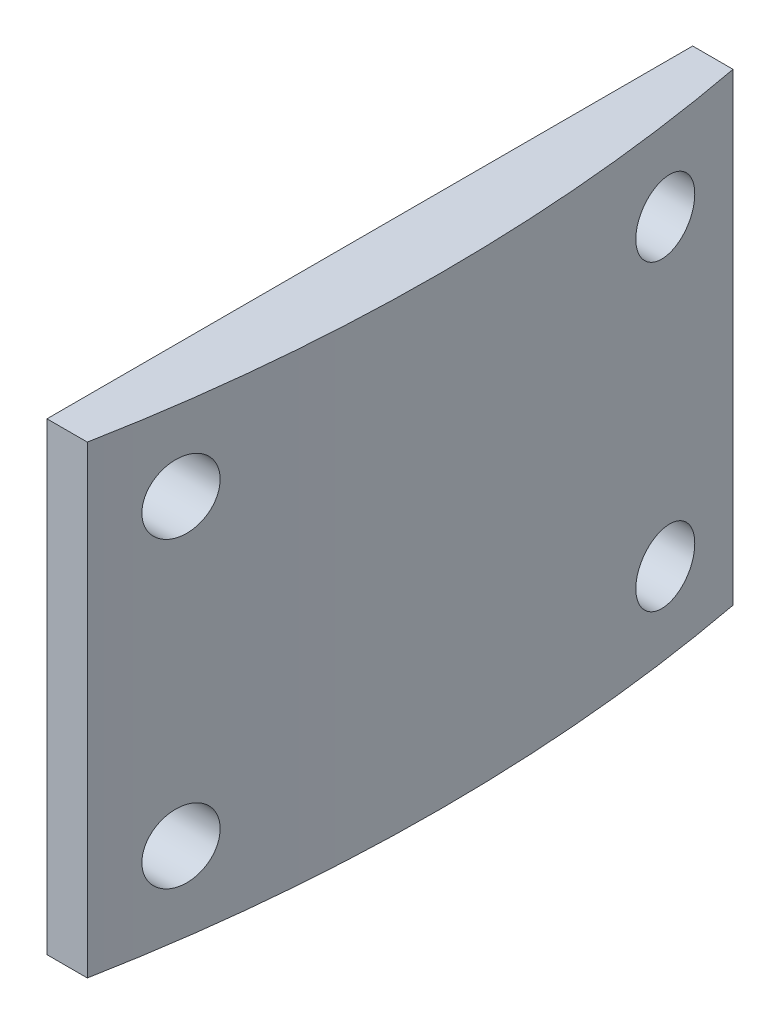
ISO-10303-21;
HEADER;
FILE_DESCRIPTION(('STEP AP214'),'2;1');
FILE_NAME('part.step','',(''),(''),'','','');
FILE_SCHEMA(('AUTOMOTIVE_DESIGN { 1 0 10303 214 1 1 1 1 }'));
ENDSEC;
DATA;
#1=APPLICATION_CONTEXT('core data for automotive mechanical design processes');
#2=APPLICATION_PROTOCOL_DEFINITION('international standard','automotive_design',2000,#1);
#3=PRODUCT_CONTEXT('',#1,'mechanical');
#4=PRODUCT('Part','Part','',(#3));
#5=PRODUCT_RELATED_PRODUCT_CATEGORY('part','',(#4));
#6=PRODUCT_DEFINITION_FORMATION('','',#4);
#7=PRODUCT_DEFINITION_CONTEXT('part definition',#1,'design');
#8=PRODUCT_DEFINITION('design','',#6,#7);
#9=PRODUCT_DEFINITION_SHAPE('','',#8);
#10=(LENGTH_UNIT() NAMED_UNIT(*) SI_UNIT(.MILLI.,.METRE.));
#11=(NAMED_UNIT(*) PLANE_ANGLE_UNIT() SI_UNIT($,.RADIAN.));
#12=(NAMED_UNIT(*) SI_UNIT($,.STERADIAN.) SOLID_ANGLE_UNIT());
#13=UNCERTAINTY_MEASURE_WITH_UNIT(LENGTH_MEASURE(1.E-05),#10,'distance_accuracy_value','');
#14=(GEOMETRIC_REPRESENTATION_CONTEXT(3) GLOBAL_UNCERTAINTY_ASSIGNED_CONTEXT((#13)) GLOBAL_UNIT_ASSIGNED_CONTEXT((#10,
#11,#12)) REPRESENTATION_CONTEXT('',''));
#15=CARTESIAN_POINT('',(0.,0.,0.));
#16=DIRECTION('',(0.,0.,1.));
#17=DIRECTION('',(1.,0.,0.));
#18=AXIS2_PLACEMENT_3D('',#15,#16,#17);
#19=CARTESIAN_POINT('',(-86.,23.,0.));
#20=DIRECTION('',(0.,-1.,0.));
#21=DIRECTION('',(0.,0.,-1.));
#22=AXIS2_PLACEMENT_3D('',#19,#20,#21);
#23=CYLINDRICAL_SURFACE('',#22,86.);
#24=CARTESIAN_POINT('',(-1.09823323393088,4.,13.7));
#25=CARTESIAN_POINT('',(-1.09823238934928,4.09461660650209,13.6999956556959));
#26=CARTESIAN_POINT('',(-1.09695288068832,4.18930217870366,13.6920726748604));
#27=CARTESIAN_POINT('',(-1.09188265318241,4.37604750009561,13.6605948866621));
#28=CARTESIAN_POINT('',(-1.0880889092167,4.46810394657926,13.6370212484123));
#29=CARTESIAN_POINT('',(-1.07814696690637,4.64684041118867,13.5749717606372));
#30=CARTESIAN_POINT('',(-1.07200058310217,4.73352451316733,13.5365073957486));
#31=CARTESIAN_POINT('',(-1.05759822182475,4.89915249166427,13.4458349382769));
#32=CARTESIAN_POINT('',(-1.04934270525876,4.97809805407112,13.3936298483691));
#33=CARTESIAN_POINT('',(-1.03097926415613,5.12658407823612,13.2766348294509));
#34=CARTESIAN_POINT('',(-1.02086028744792,5.1960638779774,13.2117696684666));
#35=CARTESIAN_POINT('',(-0.999174665954189,5.32317683807192,13.0715231762934));
#36=CARTESIAN_POINT('',(-0.987607883529901,5.38080887071348,12.996140845189));
#37=CARTESIAN_POINT('',(-0.963286094296263,5.48329943294548,12.8360395061718));
#38=CARTESIAN_POINT('',(-0.950518728562843,5.52800000605188,12.7512212474413));
#39=CARTESIAN_POINT('',(-0.9243402576721,5.60251859543299,12.5753733725884));
#40=CARTESIAN_POINT('',(-0.910929117833725,5.63233580893086,12.4843434217216));
#41=CARTESIAN_POINT('',(-0.883761715338452,5.67648760433625,12.2977616549108));
#42=CARTESIAN_POINT('',(-0.870003427762707,5.69067963207942,12.202176372701));
#43=CARTESIAN_POINT('',(-0.842672589945407,5.7026963284009,12.0099546972808));
#44=CARTESIAN_POINT('',(-0.829100043359098,5.70052067533788,11.9133182834519));
#45=CARTESIAN_POINT('',(-0.802489592723157,5.67981128127098,11.7215024294293));
#46=CARTESIAN_POINT('',(-0.789453017109356,5.66123919078498,11.6263269374469));
#47=CARTESIAN_POINT('',(-0.764290948523016,5.60816409434666,11.4403980981461));
#48=CARTESIAN_POINT('',(-0.752165441862862,5.57366132778753,11.349644684399));
#49=CARTESIAN_POINT('',(-0.729171197522125,5.48983638125947,11.1755733117123));
#50=CARTESIAN_POINT('',(-0.71829729233167,5.44057840015831,11.0922251299305));
#51=CARTESIAN_POINT('',(-0.697991204847541,5.32854509696136,10.9349710131723));
#52=CARTESIAN_POINT('',(-0.688558964593615,5.26577031853526,10.8610646986175));
#53=CARTESIAN_POINT('',(-0.671400622730218,5.12901077464027,10.7254266342001));
#54=CARTESIAN_POINT('',(-0.663661689765663,5.0551180278206,10.6636037311195));
#55=CARTESIAN_POINT('',(-0.64994411674221,4.89785174698937,10.5532489391876));
#56=CARTESIAN_POINT('',(-0.643965400311687,4.81447862452651,10.504716473702));
#57=CARTESIAN_POINT('',(-0.633914089558432,4.6413200194176,10.4227193102826));
#58=CARTESIAN_POINT('',(-0.629826991262918,4.55158962545475,10.3891400367499));
#59=CARTESIAN_POINT('',(-0.62355824563811,4.36770631962592,10.3374985463865));
#60=CARTESIAN_POINT('',(-0.621376535978219,4.27355355253433,10.3194358219663));
#61=CARTESIAN_POINT('',(-0.618959597037669,4.08402316572226,10.2994195298237));
#62=CARTESIAN_POINT('',(-0.618714307510821,3.98865445830996,10.297382703248));
#63=CARTESIAN_POINT('',(-0.620147505127369,3.79893105971888,10.3092590651682));
#64=CARTESIAN_POINT('',(-0.621825964247447,3.7045763537893,10.323172021323));
#65=CARTESIAN_POINT('',(-0.627076488057534,3.51969562769991,10.3665038164833));
#66=CARTESIAN_POINT('',(-0.630645859332186,3.42916435897929,10.3959005999832));
#67=CARTESIAN_POINT('',(-0.639618723750359,3.25434022291627,10.4693203305905));
#68=CARTESIAN_POINT('',(-0.645022227720241,3.17004739240117,10.5133433640325));
#69=CARTESIAN_POINT('',(-0.65758760378121,3.00984662032979,10.6148602895866));
#70=CARTESIAN_POINT('',(-0.664753989454039,2.93396093893322,10.672388742663));
#71=CARTESIAN_POINT('',(-0.680707042037325,2.79292598587565,10.7991815178668));
#72=CARTESIAN_POINT('',(-0.689493752327297,2.7277770017472,10.8684461541926));
#73=CARTESIAN_POINT('',(-0.708573260745442,2.60962895245031,11.0171760941626));
#74=CARTESIAN_POINT('',(-0.718874903216449,2.55670627942808,11.0967009386061));
#75=CARTESIAN_POINT('',(-0.740723862361149,2.46494807458946,11.2633425945478));
#76=CARTESIAN_POINT('',(-0.752271229800875,2.42611311716004,11.3504597154202));
#77=CARTESIAN_POINT('',(-0.776443568951132,2.36329864835854,11.530556919443));
#78=CARTESIAN_POINT('',(-0.789076496920188,2.33944175829313,11.6235787032759));
#79=CARTESIAN_POINT('',(-0.815021277608676,2.30769780037563,11.8122166697818));
#80=CARTESIAN_POINT('',(-0.828333162245903,2.29981148401189,11.9078329743244));
#81=CARTESIAN_POINT('',(-0.855375472149323,2.30019675673125,12.0996845137304));
#82=CARTESIAN_POINT('',(-0.869108236368095,2.30858621135776,12.1959191955302));
#83=CARTESIAN_POINT('',(-0.896497528607763,2.34151274547187,12.3855986468433));
#84=CARTESIAN_POINT('',(-0.910154054399002,2.36605029475499,12.4790433351047));
#85=CARTESIAN_POINT('',(-0.937002460070097,2.43069480047814,12.6607628274636));
#86=CARTESIAN_POINT('',(-0.95019290692713,2.47084586945991,12.749022160916));
#87=CARTESIAN_POINT('',(-0.975625422728232,2.56561738449194,12.9175461559871));
#88=CARTESIAN_POINT('',(-0.987867539036589,2.62023710730356,12.9978112169363));
#89=CARTESIAN_POINT('',(-1.01091739585572,2.74217800589422,13.1476831635157));
#90=CARTESIAN_POINT('',(-1.02173111639353,2.8094431731552,13.2173346844583));
#91=CARTESIAN_POINT('',(-1.04158316707755,2.95498189811627,13.3443453770041));
#92=CARTESIAN_POINT('',(-1.05062114780131,3.03325761723596,13.4017021294973));
#93=CARTESIAN_POINT('',(-1.06648240035618,3.19774682782218,13.5018569883923));
#94=CARTESIAN_POINT('',(-1.07332673524422,3.28387395516054,13.5447937571661));
#95=CARTESIAN_POINT('',(-1.08463870560966,3.46219583752384,13.615532030002));
#96=CARTESIAN_POINT('',(-1.08910941993909,3.554382557185,13.6433531418652));
#97=CARTESIAN_POINT('',(-1.09427106967746,3.70599765913323,13.6754281807255));
#98=CARTESIAN_POINT('',(-1.09575432460879,3.76439871860997,13.6846302672464));
#99=CARTESIAN_POINT('',(-1.09773566687477,3.88185755738207,13.6969175111722));
#100=CARTESIAN_POINT('',(-1.09823376134172,3.94091533191986,13.7000027128617));
#101=CARTESIAN_POINT('',(-1.09823323393088,4.,13.7));
#102=B_SPLINE_CURVE_WITH_KNOTS('',3,(#24,#25,#26,#27,#28,#29,#30,#31,#32,#33,#34,#35,#36,#37,
#38,#39,#40,#41,#42,#43,#44,#45,#46,#47,#48,#49,#50,#51,#52,#53,#54,#55,#56,#57,#58,#59,#60,#61,
#62,#63,#64,#65,#66,#67,#68,#69,#70,#71,#72,#73,#74,#75,#76,#77,#78,#79,#80,#81,#82,#83,#84,#85,
#86,#87,#88,#89,#90,#91,#92,#93,#94,#95,#96,#97,#98,#99,#100,#101),.UNSPECIFIED.,.T.,.F.,(4,2,2,
2,2,2,2,2,2,2,2,2,2,2,2,2,2,2,2,2,2,2,2,2,2,2,2,2,2,2,2,2,2,2,2,2,2,2,4),(0.,0.283632613605656,
0.567607114244634,0.851363031370888,1.13505699248658,1.4204911522477,1.70595246805858,
1.99476615600279,2.28359542026162,2.5750384856026,2.86648727810669,3.15861954886899,
3.45074742984905,3.74162230269857,4.03248547822695,4.32106175496406,4.60962550921435,
4.89593847168151,5.18224206769953,5.46705725087639,5.75186828519239,6.03627472115702,
6.32068283592084,6.60582685364614,6.89097850638832,7.1778663556988,7.46476590073994,
7.75398459300819,8.04321689401915,8.33455157181348,8.62589472576423,8.91806705660865,
9.21022478551032,9.5011177560327,9.79206791001927,10.0801343342251,10.3678261854089,
10.5449458346816,10.7220642016485),.UNSPECIFIED.);
#103=CARTESIAN_POINT('',(-1.09823323393088,4.,13.7));
#104=VERTEX_POINT('',#103);
#105=EDGE_CURVE('E112',#104,#104,#102,.T.);
#106=ORIENTED_EDGE('',*,*,#105,.T.);
#107=EDGE_LOOP('',(#106));
#108=FACE_BOUND('',#107,.T.);
#109=CARTESIAN_POINT('',(-1.09823323393088,19.,13.7));
#110=CARTESIAN_POINT('',(-1.09823238934928,19.0946166065021,13.6999956556959));
#111=CARTESIAN_POINT('',(-1.09695288068832,19.1893021787037,13.6920726748604));
#112=CARTESIAN_POINT('',(-1.09188265318241,19.3760475000956,13.6605948866621));
#113=CARTESIAN_POINT('',(-1.0880889092167,19.4681039465793,13.6370212484123));
#114=CARTESIAN_POINT('',(-1.07814696690637,19.6468404111887,13.5749717606372));
#115=CARTESIAN_POINT('',(-1.07200058310217,19.7335245131673,13.5365073957486));
#116=CARTESIAN_POINT('',(-1.05759822182475,19.8991524916643,13.4458349382769));
#117=CARTESIAN_POINT('',(-1.04934270525876,19.9780980540711,13.3936298483691));
#118=CARTESIAN_POINT('',(-1.03097926415613,20.1265840782361,13.2766348294509));
#119=CARTESIAN_POINT('',(-1.02086028744792,20.1960638779774,13.2117696684666));
#120=CARTESIAN_POINT('',(-0.999174665954189,20.3231768380719,13.0715231762934));
#121=CARTESIAN_POINT('',(-0.987607883529902,20.3808088707135,12.996140845189));
#122=CARTESIAN_POINT('',(-0.963286094296263,20.4832994329455,12.8360395061718));
#123=CARTESIAN_POINT('',(-0.950518728562843,20.5280000060519,12.7512212474413));
#124=CARTESIAN_POINT('',(-0.9243402576721,20.602518595433,12.5753733725884));
#125=CARTESIAN_POINT('',(-0.910929117833725,20.6323358089309,12.4843434217216));
#126=CARTESIAN_POINT('',(-0.883761715338453,20.6764876043363,12.2977616549108));
#127=CARTESIAN_POINT('',(-0.870003427762709,20.6906796320794,12.202176372701));
#128=CARTESIAN_POINT('',(-0.842672589945409,20.7026963284009,12.0099546972808));
#129=CARTESIAN_POINT('',(-0.8291000433591,20.7005206753379,11.9133182834519));
#130=CARTESIAN_POINT('',(-0.802489592723156,20.679811281271,11.7215024294293));
#131=CARTESIAN_POINT('',(-0.789453017109352,20.661239190785,11.6263269374469));
#132=CARTESIAN_POINT('',(-0.764290948523004,20.6081640943467,11.4403980981461));
#133=CARTESIAN_POINT('',(-0.752165441862844,20.5736613277875,11.349644684399));
#134=CARTESIAN_POINT('',(-0.729171197522115,20.4898363812595,11.1755733117123));
#135=CARTESIAN_POINT('',(-0.718297292331673,20.4405784001583,11.0922251299305));
#136=CARTESIAN_POINT('',(-0.697991204847549,20.3285450969614,10.9349710131723));
#137=CARTESIAN_POINT('',(-0.688558964593617,20.2657703185353,10.8610646986175));
#138=CARTESIAN_POINT('',(-0.671400622730217,20.1290107746403,10.7254266342001));
#139=CARTESIAN_POINT('',(-0.663661689765664,20.0551180278206,10.6636037311195));
#140=CARTESIAN_POINT('',(-0.649944116742213,19.8978517469894,10.5532489391876));
#141=CARTESIAN_POINT('',(-0.643965400311688,19.8144786245265,10.504716473702));
#142=CARTESIAN_POINT('',(-0.633914089558431,19.6413200194176,10.4227193102826));
#143=CARTESIAN_POINT('',(-0.629826991262918,19.5515896254548,10.3891400367499));
#144=CARTESIAN_POINT('',(-0.62355824563811,19.3677063196259,10.3374985463865));
#145=CARTESIAN_POINT('',(-0.62137653597822,19.2735535525343,10.3194358219663));
#146=CARTESIAN_POINT('',(-0.61895959703767,19.0840231657223,10.2994195298237));
#147=CARTESIAN_POINT('',(-0.618714307510822,18.98865445831,10.297382703248));
#148=CARTESIAN_POINT('',(-0.62014750512737,18.7989310597189,10.3092590651682));
#149=CARTESIAN_POINT('',(-0.621825964247448,18.7045763537893,10.323172021323));
#150=CARTESIAN_POINT('',(-0.627076488057535,18.5196956276999,10.3665038164833));
#151=CARTESIAN_POINT('',(-0.630645859332187,18.4291643589793,10.3959005999832));
#152=CARTESIAN_POINT('',(-0.639618723750359,18.2543402229163,10.4693203305905));
#153=CARTESIAN_POINT('',(-0.645022227720241,18.1700473924012,10.5133433640325));
#154=CARTESIAN_POINT('',(-0.65758760378121,18.0098466203298,10.6148602895866));
#155=CARTESIAN_POINT('',(-0.66475398945404,17.9339609389332,10.672388742663));
#156=CARTESIAN_POINT('',(-0.680707042037325,17.7929259858757,10.7991815178668));
#157=CARTESIAN_POINT('',(-0.689493752327298,17.7277770017472,10.8684461541926));
#158=CARTESIAN_POINT('',(-0.708573260745442,17.6096289524503,11.0171760941626));
#159=CARTESIAN_POINT('',(-0.718874903216449,17.5567062794281,11.0967009386061));
#160=CARTESIAN_POINT('',(-0.740723862361149,17.4649480745895,11.2633425945478));
#161=CARTESIAN_POINT('',(-0.752271229800875,17.42611311716,11.3504597154202));
#162=CARTESIAN_POINT('',(-0.776443568951133,17.3632986483585,11.530556919443));
#163=CARTESIAN_POINT('',(-0.789076496920188,17.3394417582931,11.6235787032759));
#164=CARTESIAN_POINT('',(-0.815021277608676,17.3076978003756,11.8122166697818));
#165=CARTESIAN_POINT('',(-0.828333162245903,17.2998114840119,11.9078329743244));
#166=CARTESIAN_POINT('',(-0.855375472149323,17.3001967567313,12.0996845137304));
#167=CARTESIAN_POINT('',(-0.869108236368095,17.3085862113578,12.1959191955302));
#168=CARTESIAN_POINT('',(-0.896497528607763,17.3415127454719,12.3855986468433));
#169=CARTESIAN_POINT('',(-0.910154054399002,17.366050294755,12.4790433351047));
#170=CARTESIAN_POINT('',(-0.937002460070097,17.4306948004781,12.6607628274636));
#171=CARTESIAN_POINT('',(-0.95019290692713,17.4708458694599,12.749022160916));
#172=CARTESIAN_POINT('',(-0.975625422728232,17.5656173844919,12.9175461559871));
#173=CARTESIAN_POINT('',(-0.987867539036589,17.6202371073036,12.9978112169363));
#174=CARTESIAN_POINT('',(-1.01091739585572,17.7421780058942,13.1476831635157));
#175=CARTESIAN_POINT('',(-1.02173111639353,17.8094431731552,13.2173346844583));
#176=CARTESIAN_POINT('',(-1.04158316707755,17.9549818981163,13.3443453770041));
#177=CARTESIAN_POINT('',(-1.05062114780131,18.033257617236,13.4017021294973));
#178=CARTESIAN_POINT('',(-1.06648240035618,18.1977468278222,13.5018569883923));
#179=CARTESIAN_POINT('',(-1.07332673524422,18.2838739551605,13.5447937571661));
#180=CARTESIAN_POINT('',(-1.08463870560966,18.4621958375239,13.615532030002));
#181=CARTESIAN_POINT('',(-1.08910941993909,18.554382557185,13.6433531418652));
#182=CARTESIAN_POINT('',(-1.09427106967746,18.7059976591332,13.6754281807255));
#183=CARTESIAN_POINT('',(-1.09575432460879,18.76439871861,13.6846302672464));
#184=CARTESIAN_POINT('',(-1.09773566687477,18.8818575573821,13.6969175111722));
#185=CARTESIAN_POINT('',(-1.09823376134172,18.9409153319199,13.7000027128617));
#186=CARTESIAN_POINT('',(-1.09823323393088,19.,13.7));
#187=B_SPLINE_CURVE_WITH_KNOTS('',3,(#109,#110,#111,#112,#113,#114,#115,#116,#117,#118,#119,
#120,#121,#122,#123,#124,#125,#126,#127,#128,#129,#130,#131,#132,#133,#134,#135,#136,#137,#138,
#139,#140,#141,#142,#143,#144,#145,#146,#147,#148,#149,#150,#151,#152,#153,#154,#155,#156,#157,
#158,#159,#160,#161,#162,#163,#164,#165,#166,#167,#168,#169,#170,#171,#172,#173,#174,#175,#176,
#177,#178,#179,#180,#181,#182,#183,#184,#185,#186),.UNSPECIFIED.,.T.,.F.,(4,2,2,2,2,2,2,2,2,2,2,
2,2,2,2,2,2,2,2,2,2,2,2,2,2,2,2,2,2,2,2,2,2,2,2,2,2,2,4),(0.,0.283632613605657,
0.567607114244634,0.851363031370889,1.13505699248658,1.4204911522477,1.70595246805858,
1.99476615600279,2.28359542026162,2.5750384856026,2.86648727810669,3.158619548869,
3.45074742984905,3.74162230269857,4.03248547822695,4.32106175496406,4.60962550921435,
4.89593847168151,5.18224206769953,5.46705725087639,5.75186828519239,6.03627472115702,
6.32068283592084,6.60582685364614,6.89097850638832,7.17786635569879,7.46476590073993,
7.75398459300819,8.04321689401915,8.33455157181348,8.62589472576423,8.91806705660865,
9.21022478551032,9.5011177560327,9.79206791001927,10.0801343342251,10.3678261854089,
10.5449458346816,10.7220642016485),.UNSPECIFIED.);
#188=CARTESIAN_POINT('',(-1.09823323393088,19.,13.7));
#189=VERTEX_POINT('',#188);
#190=EDGE_CURVE('E136',#189,#189,#187,.T.);
#191=ORIENTED_EDGE('',*,*,#190,.T.);
#192=EDGE_LOOP('',(#191));
#193=FACE_BOUND('',#192,.T.);
#194=CARTESIAN_POINT('',(-0.619030223357145,19.,-10.3));
#195=CARTESIAN_POINT('',(-0.619030596904295,19.0949561140651,-10.300004283749));
#196=CARTESIAN_POINT('',(-0.619992147030582,19.1899811422341,-10.3079835108829));
#197=CARTESIAN_POINT('',(-0.623826558895004,19.3774058628432,-10.3396931122186));
#198=CARTESIAN_POINT('',(-0.626701716453331,19.4698022626167,-10.3634424062288));
#199=CARTESIAN_POINT('',(-0.634316776572341,19.649218964929,-10.4259826451769));
#200=CARTESIAN_POINT('',(-0.639055542736889,19.7362425063978,-10.4647644233605));
#201=CARTESIAN_POINT('',(-0.650317239477932,19.9024953526684,-10.5562192576347));
#202=CARTESIAN_POINT('',(-0.656839744367727,19.9817265109852,-10.6088889992753));
#203=CARTESIAN_POINT('',(-0.671575341554959,20.1304422513217,-10.7267643275984));
#204=CARTESIAN_POINT('',(-0.679793365926328,20.1998973815206,-10.7920064485283));
#205=CARTESIAN_POINT('',(-0.697751130722403,20.3268772394952,-10.9330408014666));
#206=CARTESIAN_POINT('',(-0.707490975684748,20.3844011470533,-11.0088337581991));
#207=CARTESIAN_POINT('',(-0.728363663323788,20.4863175176866,-11.1693608807518));
#208=CARTESIAN_POINT('',(-0.739505683549196,20.5306163077276,-11.2541533179533));
#209=CARTESIAN_POINT('',(-0.762878357947854,20.6043624133738,-11.4298267664131));
#210=CARTESIAN_POINT('',(-0.775109059108582,20.6338090875955,-11.5207080404238));
#211=CARTESIAN_POINT('',(-0.80046691776403,20.6772646229908,-11.7067691552202));
#212=CARTESIAN_POINT('',(-0.813600598692123,20.6911450311392,-11.8019781127485));
#213=CARTESIAN_POINT('',(-0.840327457755062,20.7026866326145,-11.9933107781639));
#214=CARTESIAN_POINT('',(-0.853920654326494,20.7003471744011,-12.0894345226426));
#215=CARTESIAN_POINT('',(-0.881268060965328,20.6794669913172,-12.2805067690149));
#216=CARTESIAN_POINT('',(-0.895022746261263,20.6608248834659,-12.3754441389799));
#217=CARTESIAN_POINT('',(-0.922188005266204,20.6077180451985,-12.5608395378447));
#218=CARTESIAN_POINT('',(-0.93559857264474,20.5732530239206,-12.6512974843684));
#219=CARTESIAN_POINT('',(-0.961647837045131,20.4894059545648,-12.8252254536499));
#220=CARTESIAN_POINT('',(-0.97428593414777,20.4400124853023,-12.9086900634066));
#221=CARTESIAN_POINT('',(-0.998338678090074,20.3276688112192,-13.066136572258));
#222=CARTESIAN_POINT('',(-1.00975335736386,20.2647189659258,-13.1401187227531));
#223=CARTESIAN_POINT('',(-1.03086860257328,20.1274576603512,-13.2759713793396));
#224=CARTESIAN_POINT('',(-1.04057979331962,20.0532224406805,-13.3379172385852));
#225=CARTESIAN_POINT('',(-1.05800327024544,19.8951759024878,-13.4484323260884));
#226=CARTESIAN_POINT('',(-1.06571568492839,19.8113652000832,-13.4970024143013));
#227=CARTESIAN_POINT('',(-1.07875533125692,19.6375717567362,-13.5788036429984));
#228=CARTESIAN_POINT('',(-1.08410883548524,19.5476705758229,-13.6122038751305));
#229=CARTESIAN_POINT('',(-1.0923391174779,19.3634312862054,-13.6634477237458));
#230=CARTESIAN_POINT('',(-1.09521606083056,19.2690934745889,-13.6812923803103));
#231=CARTESIAN_POINT('',(-1.09835674670161,19.0797072537474,-13.7007689758297));
#232=CARTESIAN_POINT('',(-1.09864725532997,18.984676333777,-13.7025669764973));
#233=CARTESIAN_POINT('',(-1.09667324043365,18.7956684636087,-13.6903302503573));
#234=CARTESIAN_POINT('',(-1.09440879123574,18.7016914828307,-13.6762959841291));
#235=CARTESIAN_POINT('',(-1.08742947906113,18.5177632413883,-13.6328956330885));
#236=CARTESIAN_POINT('',(-1.08272245391595,18.42780009782,-13.6035785868803));
#237=CARTESIAN_POINT('',(-1.07105147525813,18.2540933565077,-13.5305233792796));
#238=CARTESIAN_POINT('',(-1.06408747213607,18.1703498955249,-13.486784900897));
#239=CARTESIAN_POINT('',(-1.04812632302061,18.0109145935616,-13.3858796188379));
#240=CARTESIAN_POINT('',(-1.03911755345498,17.935272572474,-13.328635968002));
#241=CARTESIAN_POINT('',(-1.01942878339415,17.7946523422757,-13.202521693522));
#242=CARTESIAN_POINT('',(-1.00874868673169,17.7296747472315,-13.1336504008118));
#243=CARTESIAN_POINT('',(-0.985970281647108,17.6114426479879,-12.9853928784393));
#244=CARTESIAN_POINT('',(-0.973857294608397,17.558329097426,-12.905896498063));
#245=CARTESIAN_POINT('',(-0.948729689490145,17.4661893873918,-12.7392508366686));
#246=CARTESIAN_POINT('',(-0.935715018110939,17.42716406154,-12.6521011031697));
#247=CARTESIAN_POINT('',(-0.909066964968079,17.3639057333595,-12.4716283641437));
#248=CARTESIAN_POINT('',(-0.895428527676105,17.3398320791122,-12.3782502237341));
#249=CARTESIAN_POINT('',(-0.868085700546979,17.3077839698744,-12.1887787394055));
#250=CARTESIAN_POINT('',(-0.854381308387709,17.2998100859381,-12.0926852992982));
#251=CARTESIAN_POINT('',(-0.827242690298348,17.3001976718544,-11.9000385240503));
#252=CARTESIAN_POINT('',(-0.813809998808444,17.3086345230597,-11.8034851085409));
#253=CARTESIAN_POINT('',(-0.787648868095052,17.3417916172166,-11.6131154071772));
#254=CARTESIAN_POINT('',(-0.774920426376095,17.3665118024651,-11.5192991116246));
#255=CARTESIAN_POINT('',(-0.75052300383937,17.4315034271054,-11.3373314876308));
#256=CARTESIAN_POINT('',(-0.738851505848996,17.4717366506136,-11.2491668541372));
#257=CARTESIAN_POINT('',(-0.716809662628972,17.566664199264,-11.0808240218792));
#258=CARTESIAN_POINT('',(-0.706439221722397,17.621357460126,-11.0006452359424));
#259=CARTESIAN_POINT('',(-0.687296280242016,17.743235541562,-10.8511856749214));
#260=CARTESIAN_POINT('',(-0.678512713016232,17.8103266786072,-10.7818299242212));
#261=CARTESIAN_POINT('',(-0.662625650959076,17.9553983650469,-10.6553561108548));
#262=CARTESIAN_POINT('',(-0.655522502647066,18.0333811551468,-10.5982405724722));
#263=CARTESIAN_POINT('',(-0.643179437986841,18.1973502161364,-10.4983667581533));
#264=CARTESIAN_POINT('',(-0.637925630920834,18.2832704203824,-10.4555015868146));
#265=CARTESIAN_POINT('',(-0.629300887905376,18.4611052669618,-10.384845326716));
#266=CARTESIAN_POINT('',(-0.625927602653327,18.5530122689695,-10.3570354309286));
#267=CARTESIAN_POINT('',(-0.622025622659843,18.7046039079661,-10.3248067185063));
#268=CARTESIAN_POINT('',(-0.620903242409819,18.7632824692124,-10.3155162976115));
#269=CARTESIAN_POINT('',(-0.619405427322351,18.8812983769603,-10.303111610309));
#270=CARTESIAN_POINT('',(-0.61902998982445,18.9406357211147,-10.2999973219032));
#271=CARTESIAN_POINT('',(-0.619030223357145,19.,-10.3));
#272=B_SPLINE_CURVE_WITH_KNOTS('',3,(#194,#195,#196,#197,#198,#199,#200,#201,#202,#203,#204,
#205,#206,#207,#208,#209,#210,#211,#212,#213,#214,#215,#216,#217,#218,#219,#220,#221,#222,#223,
#224,#225,#226,#227,#228,#229,#230,#231,#232,#233,#234,#235,#236,#237,#238,#239,#240,#241,#242,
#243,#244,#245,#246,#247,#248,#249,#250,#251,#252,#253,#254,#255,#256,#257,#258,#259,#260,#261,
#262,#263,#264,#265,#266,#267,#268,#269,#270,#271),.UNSPECIFIED.,.T.,.F.,(4,2,2,2,2,2,2,2,2,2,2,
2,2,2,2,2,2,2,2,2,2,2,2,2,2,2,2,2,2,2,2,2,2,2,2,2,2,2,4),(0.,0.284650955433206,
0.569644033414384,0.854463596361694,1.13921524675365,1.42480719083395,1.7104187615666,
1.99800776561326,2.28560918802769,2.57556682786618,2.86553611516161,3.15732159151295,
3.44911243177167,3.74112707757933,4.03313397985019,4.32324929951189,4.61334596271537,
4.90012451896841,5.18688389908462,5.47067221277384,5.75445227093623,6.03732730462307,
6.32020855645596,6.60474002743149,6.88928787621874,7.1770551215138,7.46483939161977,
7.7556403481283,8.04645161908071,8.3386018624485,8.63075107053226,8.92218512955258,
9.21359774456425,9.50289224623616,9.79224635146014,10.079378207746,10.3661505467949,
10.5441081123246,10.7220650440048),.UNSPECIFIED.);
#273=CARTESIAN_POINT('',(-0.619030223357145,19.,-10.3));
#274=VERTEX_POINT('',#273);
#275=EDGE_CURVE('E165',#274,#274,#272,.T.);
#276=ORIENTED_EDGE('',*,*,#275,.T.);
#277=EDGE_LOOP('',(#276));
#278=FACE_BOUND('',#277,.T.);
#279=CARTESIAN_POINT('',(-0.619030223357145,4.,-10.3));
#280=CARTESIAN_POINT('',(-0.619030596904295,4.09495611406507,-10.300004283749));
#281=CARTESIAN_POINT('',(-0.619992147030582,4.18998114223414,-10.3079835108829));
#282=CARTESIAN_POINT('',(-0.623826558895003,4.37740586284316,-10.3396931122186));
#283=CARTESIAN_POINT('',(-0.626701716453331,4.46980226261675,-10.3634424062288));
#284=CARTESIAN_POINT('',(-0.634316776572341,4.64921896492897,-10.4259826451769));
#285=CARTESIAN_POINT('',(-0.639055542736889,4.73624250639779,-10.4647644233605));
#286=CARTESIAN_POINT('',(-0.650317239477932,4.90249535266836,-10.5562192576347));
#287=CARTESIAN_POINT('',(-0.656839744367726,4.98172651098518,-10.6088889992753));
#288=CARTESIAN_POINT('',(-0.671575341554959,5.13044225132173,-10.7267643275984));
#289=CARTESIAN_POINT('',(-0.679793365926328,5.19989738152058,-10.7920064485283));
#290=CARTESIAN_POINT('',(-0.697751130722403,5.32687723949519,-10.9330408014666));
#291=CARTESIAN_POINT('',(-0.707490975684747,5.38440114705335,-11.0088337581991));
#292=CARTESIAN_POINT('',(-0.728363663323788,5.48631751768661,-11.1693608807518));
#293=CARTESIAN_POINT('',(-0.739505683549196,5.5306163077276,-11.2541533179533));
#294=CARTESIAN_POINT('',(-0.762878357947854,5.60436241337379,-11.4298267664131));
#295=CARTESIAN_POINT('',(-0.775109059108582,5.63380908759554,-11.5207080404238));
#296=CARTESIAN_POINT('',(-0.80046691776403,5.67726462299078,-11.7067691552202));
#297=CARTESIAN_POINT('',(-0.813600598692123,5.69114503113918,-11.8019781127485));
#298=CARTESIAN_POINT('',(-0.840327457755062,5.70268663261451,-11.9933107781639));
#299=CARTESIAN_POINT('',(-0.853920654326495,5.70034717440109,-12.0894345226426));
#300=CARTESIAN_POINT('',(-0.881268060965328,5.67946699131723,-12.2805067690149));
#301=CARTESIAN_POINT('',(-0.895022746261263,5.66082488346591,-12.3754441389799));
#302=CARTESIAN_POINT('',(-0.922188005266204,5.60771804519847,-12.5608395378447));
#303=CARTESIAN_POINT('',(-0.93559857264474,5.57325302392056,-12.6512974843684));
#304=CARTESIAN_POINT('',(-0.961647837045131,5.48940595456484,-12.8252254536499));
#305=CARTESIAN_POINT('',(-0.97428593414777,5.44001248530229,-12.9086900634066));
#306=CARTESIAN_POINT('',(-0.998338678090074,5.32766881121915,-13.066136572258));
#307=CARTESIAN_POINT('',(-1.00975335736386,5.26471896592582,-13.1401187227531));
#308=CARTESIAN_POINT('',(-1.03086860257328,5.12745766035116,-13.2759713793396));
#309=CARTESIAN_POINT('',(-1.04057979331962,5.05322244068052,-13.3379172385852));
#310=CARTESIAN_POINT('',(-1.05800327024544,4.89517590248776,-13.4484323260884));
#311=CARTESIAN_POINT('',(-1.06571568492839,4.81136520008324,-13.4970024143013));
#312=CARTESIAN_POINT('',(-1.07875533125692,4.63757175673617,-13.5788036429984));
#313=CARTESIAN_POINT('',(-1.08410883548524,4.54767057582294,-13.6122038751305));
#314=CARTESIAN_POINT('',(-1.0923391174779,4.36343128620539,-13.6634477237458));
#315=CARTESIAN_POINT('',(-1.09521606083056,4.26909347458886,-13.6812923803103));
#316=CARTESIAN_POINT('',(-1.09835674670161,4.07970725374738,-13.7007689758297));
#317=CARTESIAN_POINT('',(-1.09864725532997,3.98467633377699,-13.7025669764973));
#318=CARTESIAN_POINT('',(-1.09667324043365,3.79566846360867,-13.6903302503573));
#319=CARTESIAN_POINT('',(-1.09440879123574,3.70169148283071,-13.6762959841291));
#320=CARTESIAN_POINT('',(-1.08742947906113,3.51776324138832,-13.6328956330885));
#321=CARTESIAN_POINT('',(-1.08272245391595,3.42780009782,-13.6035785868803));
#322=CARTESIAN_POINT('',(-1.07105147525813,3.25409335650767,-13.5305233792796));
#323=CARTESIAN_POINT('',(-1.06408747213606,3.1703498955249,-13.486784900897));
#324=CARTESIAN_POINT('',(-1.04812632302061,3.0109145935616,-13.3858796188379));
#325=CARTESIAN_POINT('',(-1.03911755345498,2.93527257247397,-13.328635968002));
#326=CARTESIAN_POINT('',(-1.01942878339415,2.79465234227573,-13.202521693522));
#327=CARTESIAN_POINT('',(-1.00874868673169,2.72967474723151,-13.1336504008118));
#328=CARTESIAN_POINT('',(-0.985970281647108,2.61144264798791,-12.9853928784393));
#329=CARTESIAN_POINT('',(-0.973857294608396,2.55832909742597,-12.905896498063));
#330=CARTESIAN_POINT('',(-0.948729689490146,2.46618938739177,-12.7392508366686));
#331=CARTESIAN_POINT('',(-0.935715018110943,2.42716406153999,-12.6521011031697));
#332=CARTESIAN_POINT('',(-0.909066964968075,2.3639057333595,-12.4716283641437));
#333=CARTESIAN_POINT('',(-0.895428527676091,2.33983207911219,-12.3782502237341));
#334=CARTESIAN_POINT('',(-0.868085700546965,2.3077839698744,-12.1887787394055));
#335=CARTESIAN_POINT('',(-0.854381308387705,2.29981008593807,-12.0926852992982));
#336=CARTESIAN_POINT('',(-0.827242690298352,2.30019767185436,-11.9000385240503));
#337=CARTESIAN_POINT('',(-0.813809998808445,2.3086345230597,-11.8034851085409));
#338=CARTESIAN_POINT('',(-0.787648868095051,2.3417916172166,-11.6131154071772));
#339=CARTESIAN_POINT('',(-0.774920426376095,2.36651180246508,-11.5192991116246));
#340=CARTESIAN_POINT('',(-0.75052300383937,2.43150342710542,-11.3373314876308));
#341=CARTESIAN_POINT('',(-0.738851505848995,2.47173665061362,-11.2491668541372));
#342=CARTESIAN_POINT('',(-0.716809662628972,2.56666419926397,-11.0808240218792));
#343=CARTESIAN_POINT('',(-0.706439221722397,2.621357460126,-11.0006452359424));
#344=CARTESIAN_POINT('',(-0.687296280242016,2.74323554156197,-10.8511856749214));
#345=CARTESIAN_POINT('',(-0.678512713016232,2.81032667860722,-10.7818299242212));
#346=CARTESIAN_POINT('',(-0.662625650959076,2.95539836504689,-10.6553561108548));
#347=CARTESIAN_POINT('',(-0.655522502647066,3.03338115514675,-10.5982405724722));
#348=CARTESIAN_POINT('',(-0.643179437986841,3.19735021613643,-10.4983667581533));
#349=CARTESIAN_POINT('',(-0.637925630920834,3.28327042038243,-10.4555015868146));
#350=CARTESIAN_POINT('',(-0.629300887905375,3.46110526696177,-10.384845326716));
#351=CARTESIAN_POINT('',(-0.625927602653327,3.55301226896952,-10.3570354309286));
#352=CARTESIAN_POINT('',(-0.622025622659843,3.70460390796608,-10.3248067185063));
#353=CARTESIAN_POINT('',(-0.620903242409819,3.76328246921237,-10.3155162976115));
#354=CARTESIAN_POINT('',(-0.619405427322351,3.88129837696029,-10.303111610309));
#355=CARTESIAN_POINT('',(-0.61902998982445,3.94063572111471,-10.2999973219032));
#356=CARTESIAN_POINT('',(-0.619030223357145,4.,-10.3));
#357=B_SPLINE_CURVE_WITH_KNOTS('',3,(#279,#280,#281,#282,#283,#284,#285,#286,#287,#288,#289,
#290,#291,#292,#293,#294,#295,#296,#297,#298,#299,#300,#301,#302,#303,#304,#305,#306,#307,#308,
#309,#310,#311,#312,#313,#314,#315,#316,#317,#318,#319,#320,#321,#322,#323,#324,#325,#326,#327,
#328,#329,#330,#331,#332,#333,#334,#335,#336,#337,#338,#339,#340,#341,#342,#343,#344,#345,#346,
#347,#348,#349,#350,#351,#352,#353,#354,#355,#356),.UNSPECIFIED.,.T.,.F.,(4,2,2,2,2,2,2,2,2,2,2,
2,2,2,2,2,2,2,2,2,2,2,2,2,2,2,2,2,2,2,2,2,2,2,2,2,2,2,4),(0.,0.284650955433209,
0.569644033414384,0.854463596361693,1.13921524675365,1.42480719083396,1.7104187615666,
1.99800776561325,2.28560918802769,2.57556682786618,2.86553611516161,3.15732159151295,
3.44911243177167,3.74112707757934,4.03313397985019,4.32324929951189,4.61334596271538,
4.90012451896841,5.18688389908463,5.47067221277385,5.75445227093623,6.03732730462308,
6.32020855645597,6.6047400274315,6.88928787621874,7.1770551215138,7.46483939161977,
7.7556403481283,8.04645161908072,8.3386018624485,8.63075107053226,8.92218512955258,
9.21359774456426,9.50289224623616,9.79224635146014,10.079378207746,10.3661505467949,
10.5441081123246,10.7220650440048),.UNSPECIFIED.);
#358=CARTESIAN_POINT('',(-0.619030223357145,4.,-10.3));
#359=VERTEX_POINT('',#358);
#360=EDGE_CURVE('E158',#359,#359,#357,.T.);
#361=ORIENTED_EDGE('',*,*,#360,.T.);
#362=EDGE_LOOP('',(#361));
#363=FACE_BOUND('',#362,.T.);
#364=CARTESIAN_POINT('',(-86.,0.,0.));
#365=DIRECTION('',(0.,1.,0.));
#366=DIRECTION('',(0.,0.,-1.));
#367=AXIS2_PLACEMENT_3D('',#364,#365,#366);
#368=CIRCLE('',#367,86.);
#369=CARTESIAN_POINT('',(-1.50147930288957,0.,16.));
#370=VERTEX_POINT('',#369);
#371=CARTESIAN_POINT('',(-1.50147930288958,0.,-16.));
#372=VERTEX_POINT('',#371);
#373=EDGE_CURVE('E108',#370,#372,#368,.T.);
#374=ORIENTED_EDGE('',*,*,#373,.T.);
#375=DIRECTION('',(0.,-1.,0.));
#376=VECTOR('',#375,1.);
#377=CARTESIAN_POINT('',(-1.50147930288958,23.,-16.));
#378=LINE('',#377,#376);
#379=CARTESIAN_POINT('',(-1.50147930288958,23.,-16.));
#380=VERTEX_POINT('',#379);
#381=EDGE_CURVE('E11',#380,#372,#378,.T.);
#382=ORIENTED_EDGE('',*,*,#381,.F.);
#383=CARTESIAN_POINT('',(-86.,23.,0.));
#384=DIRECTION('',(0.,1.,0.));
#385=DIRECTION('',(0.,0.,-1.));
#386=AXIS2_PLACEMENT_3D('',#383,#384,#385);
#387=CIRCLE('',#386,86.);
#388=CARTESIAN_POINT('',(-1.50147930288957,23.,16.));
#389=VERTEX_POINT('',#388);
#390=EDGE_CURVE('E92',#389,#380,#387,.T.);
#391=ORIENTED_EDGE('',*,*,#390,.F.);
#392=DIRECTION('',(0.,-1.,0.));
#393=VECTOR('',#392,1.);
#394=CARTESIAN_POINT('',(-1.50147930288957,23.,16.));
#395=LINE('',#394,#393);
#396=EDGE_CURVE('E104',#389,#370,#395,.T.);
#397=ORIENTED_EDGE('',*,*,#396,.T.);
#398=EDGE_LOOP('',(#374,#382,#391,#397));
#399=FACE_BOUND('',#398,.T.);
#400=ADVANCED_FACE('F39',(#108,#193,#278,#363,#399),#23,.T.);
#401=CARTESIAN_POINT('',(-1.50147930288958,23.,-16.));
#402=DIRECTION('',(0.,0.,1.));
#403=DIRECTION('',(1.,0.,0.));
#404=AXIS2_PLACEMENT_3D('',#401,#402,#403);
#405=PLANE('',#404);
#406=DIRECTION('',(-1.,0.,0.));
#407=VECTOR('',#406,1.);
#408=CARTESIAN_POINT('',(-1.50147930288958,0.,-16.));
#409=LINE('',#408,#407);
#410=CARTESIAN_POINT('',(-3.50147930288958,0.,-16.));
#411=VERTEX_POINT('',#410);
#412=EDGE_CURVE('E97',#372,#411,#409,.T.);
#413=ORIENTED_EDGE('',*,*,#412,.T.);
#414=DIRECTION('',(0.,-1.,0.));
#415=VECTOR('',#414,1.);
#416=CARTESIAN_POINT('',(-3.50147930288958,23.,-16.));
#417=LINE('',#416,#415);
#418=CARTESIAN_POINT('',(-3.50147930288958,23.,-16.));
#419=VERTEX_POINT('',#418);
#420=EDGE_CURVE('E49',#419,#411,#417,.T.);
#421=ORIENTED_EDGE('',*,*,#420,.F.);
#422=DIRECTION('',(-1.,0.,0.));
#423=VECTOR('',#422,1.);
#424=CARTESIAN_POINT('',(-1.50147930288958,23.,-16.));
#425=LINE('',#424,#423);
#426=EDGE_CURVE('E87',#380,#419,#425,.T.);
#427=ORIENTED_EDGE('',*,*,#426,.F.);
#428=ORIENTED_EDGE('',*,*,#381,.T.);
#429=EDGE_LOOP('',(#413,#421,#427,#428));
#430=FACE_BOUND('',#429,.T.);
#431=ADVANCED_FACE('F96',(#430),#405,.F.);
#432=CARTESIAN_POINT('',(-3.50147930288958,23.,-16.));
#433=DIRECTION('',(1.,0.,0.));
#434=DIRECTION('',(0.,0.,-1.));
#435=AXIS2_PLACEMENT_3D('',#432,#433,#434);
#436=PLANE('',#435);
#437=CARTESIAN_POINT('',(-3.50147930288957,4.,12.));
#438=DIRECTION('',(-1.,0.,0.));
#439=DIRECTION('',(0.,0.,1.));
#440=AXIS2_PLACEMENT_3D('',#437,#438,#439);
#441=CIRCLE('',#440,1.7);
#442=CARTESIAN_POINT('',(-3.50147930288957,4.,13.7));
#443=VERTEX_POINT('',#442);
#444=EDGE_CURVE('E207',#443,#443,#441,.T.);
#445=ORIENTED_EDGE('',*,*,#444,.F.);
#446=EDGE_LOOP('',(#445));
#447=FACE_BOUND('',#446,.T.);
#448=CARTESIAN_POINT('',(-3.50147930288957,19.,12.));
#449=DIRECTION('',(-1.,0.,0.));
#450=DIRECTION('',(0.,0.,1.));
#451=AXIS2_PLACEMENT_3D('',#448,#449,#450);
#452=CIRCLE('',#451,1.7);
#453=CARTESIAN_POINT('',(-3.50147930288957,19.,13.7));
#454=VERTEX_POINT('',#453);
#455=EDGE_CURVE('E203',#454,#454,#452,.T.);
#456=ORIENTED_EDGE('',*,*,#455,.F.);
#457=EDGE_LOOP('',(#456));
#458=FACE_BOUND('',#457,.T.);
#459=CARTESIAN_POINT('',(-3.50147930288958,19.,-12.));
#460=DIRECTION('',(-1.,0.,0.));
#461=DIRECTION('',(0.,0.,1.));
#462=AXIS2_PLACEMENT_3D('',#459,#460,#461);
#463=CIRCLE('',#462,1.7);
#464=CARTESIAN_POINT('',(-3.50147930288958,19.,-10.3));
#465=VERTEX_POINT('',#464);
#466=EDGE_CURVE('E201',#465,#465,#463,.T.);
#467=ORIENTED_EDGE('',*,*,#466,.F.);
#468=EDGE_LOOP('',(#467));
#469=FACE_BOUND('',#468,.T.);
#470=CARTESIAN_POINT('',(-3.50147930288958,4.,-12.));
#471=DIRECTION('',(-1.,0.,0.));
#472=DIRECTION('',(0.,0.,1.));
#473=AXIS2_PLACEMENT_3D('',#470,#471,#472);
#474=CIRCLE('',#473,1.7);
#475=CARTESIAN_POINT('',(-3.50147930288958,4.,-10.3));
#476=VERTEX_POINT('',#475);
#477=EDGE_CURVE('E166',#476,#476,#474,.T.);
#478=ORIENTED_EDGE('',*,*,#477,.F.);
#479=EDGE_LOOP('',(#478));
#480=FACE_BOUND('',#479,.T.);
#481=DIRECTION('',(0.,0.,1.));
#482=VECTOR('',#481,1.);
#483=CARTESIAN_POINT('',(-3.50147930288958,0.,-16.));
#484=LINE('',#483,#482);
#485=CARTESIAN_POINT('',(-3.50147930288957,0.,16.));
#486=VERTEX_POINT('',#485);
#487=EDGE_CURVE('E74',#411,#486,#484,.T.);
#488=ORIENTED_EDGE('',*,*,#487,.T.);
#489=DIRECTION('',(0.,-1.,0.));
#490=VECTOR('',#489,1.);
#491=CARTESIAN_POINT('',(-3.50147930288957,23.,16.));
#492=LINE('',#491,#490);
#493=CARTESIAN_POINT('',(-3.50147930288957,23.,16.));
#494=VERTEX_POINT('',#493);
#495=EDGE_CURVE('E99',#494,#486,#492,.T.);
#496=ORIENTED_EDGE('',*,*,#495,.F.);
#497=DIRECTION('',(0.,0.,1.));
#498=VECTOR('',#497,1.);
#499=CARTESIAN_POINT('',(-3.50147930288958,23.,-16.));
#500=LINE('',#499,#498);
#501=EDGE_CURVE('E90',#419,#494,#500,.T.);
#502=ORIENTED_EDGE('',*,*,#501,.F.);
#503=ORIENTED_EDGE('',*,*,#420,.T.);
#504=EDGE_LOOP('',(#488,#496,#502,#503));
#505=FACE_BOUND('',#504,.T.);
#506=ADVANCED_FACE('F100',(#447,#458,#469,#480,#505),#436,.F.);
#507=CARTESIAN_POINT('',(-3.50147930288957,23.,16.));
#508=DIRECTION('',(0.,0.,-1.));
#509=DIRECTION('',(-1.,0.,0.));
#510=AXIS2_PLACEMENT_3D('',#507,#508,#509);
#511=PLANE('',#510);
#512=DIRECTION('',(1.,0.,0.));
#513=VECTOR('',#512,1.);
#514=CARTESIAN_POINT('',(-3.50147930288957,0.,16.));
#515=LINE('',#514,#513);
#516=EDGE_CURVE('E80',#486,#370,#515,.T.);
#517=ORIENTED_EDGE('',*,*,#516,.T.);
#518=ORIENTED_EDGE('',*,*,#396,.F.);
#519=DIRECTION('',(1.,0.,0.));
#520=VECTOR('',#519,1.);
#521=CARTESIAN_POINT('',(-3.50147930288957,23.,16.));
#522=LINE('',#521,#520);
#523=EDGE_CURVE('E57',#494,#389,#522,.T.);
#524=ORIENTED_EDGE('',*,*,#523,.F.);
#525=ORIENTED_EDGE('',*,*,#495,.T.);
#526=EDGE_LOOP('',(#517,#518,#524,#525));
#527=FACE_BOUND('',#526,.T.);
#528=ADVANCED_FACE('F122',(#527),#511,.F.);
#529=CARTESIAN_POINT('',(-86.,23.,0.));
#530=DIRECTION('',(0.,-1.,0.));
#531=DIRECTION('',(0.,0.,-1.));
#532=AXIS2_PLACEMENT_3D('',#529,#530,#531);
#533=PLANE('',#532);
#534=ORIENTED_EDGE('',*,*,#390,.T.);
#535=ORIENTED_EDGE('',*,*,#426,.T.);
#536=ORIENTED_EDGE('',*,*,#501,.T.);
#537=ORIENTED_EDGE('',*,*,#523,.T.);
#538=EDGE_LOOP('',(#534,#535,#536,#537));
#539=FACE_BOUND('',#538,.T.);
#540=ADVANCED_FACE('F88',(#539),#533,.F.);
#541=CARTESIAN_POINT('',(-86.,0.,0.));
#542=DIRECTION('',(0.,-1.,0.));
#543=DIRECTION('',(0.,0.,-1.));
#544=AXIS2_PLACEMENT_3D('',#541,#542,#543);
#545=PLANE('',#544);
#546=ORIENTED_EDGE('',*,*,#373,.F.);
#547=ORIENTED_EDGE('',*,*,#516,.F.);
#548=ORIENTED_EDGE('',*,*,#487,.F.);
#549=ORIENTED_EDGE('',*,*,#412,.F.);
#550=EDGE_LOOP('',(#546,#547,#548,#549));
#551=FACE_BOUND('',#550,.T.);
#552=ADVANCED_FACE('F125',(#551),#545,.T.);
#553=CARTESIAN_POINT('',(0.,4.,-12.));
#554=DIRECTION('',(-1.,0.,0.));
#555=DIRECTION('',(0.,0.,1.));
#556=AXIS2_PLACEMENT_3D('',#553,#554,#555);
#557=CYLINDRICAL_SURFACE('',#556,1.7);
#558=ORIENTED_EDGE('',*,*,#477,.T.);
#559=EDGE_LOOP('',(#558));
#560=FACE_BOUND('',#559,.T.);
#561=ORIENTED_EDGE('',*,*,#360,.F.);
#562=EDGE_LOOP('',(#561));
#563=FACE_BOUND('',#562,.T.);
#564=ADVANCED_FACE('F150',(#560,#563),#557,.F.);
#565=CARTESIAN_POINT('',(0.,19.,-12.));
#566=DIRECTION('',(-1.,0.,0.));
#567=DIRECTION('',(0.,0.,1.));
#568=AXIS2_PLACEMENT_3D('',#565,#566,#567);
#569=CYLINDRICAL_SURFACE('',#568,1.7);
#570=ORIENTED_EDGE('',*,*,#466,.T.);
#571=EDGE_LOOP('',(#570));
#572=FACE_BOUND('',#571,.T.);
#573=ORIENTED_EDGE('',*,*,#275,.F.);
#574=EDGE_LOOP('',(#573));
#575=FACE_BOUND('',#574,.T.);
#576=ADVANCED_FACE('F154',(#572,#575),#569,.F.);
#577=CARTESIAN_POINT('',(0.,19.,12.));
#578=DIRECTION('',(-1.,0.,0.));
#579=DIRECTION('',(0.,0.,1.));
#580=AXIS2_PLACEMENT_3D('',#577,#578,#579);
#581=CYLINDRICAL_SURFACE('',#580,1.7);
#582=ORIENTED_EDGE('',*,*,#455,.T.);
#583=EDGE_LOOP('',(#582));
#584=FACE_BOUND('',#583,.T.);
#585=ORIENTED_EDGE('',*,*,#190,.F.);
#586=EDGE_LOOP('',(#585));
#587=FACE_BOUND('',#586,.T.);
#588=ADVANCED_FACE('F146',(#584,#587),#581,.F.);
#589=CARTESIAN_POINT('',(0.,4.,12.));
#590=DIRECTION('',(-1.,0.,0.));
#591=DIRECTION('',(0.,0.,1.));
#592=AXIS2_PLACEMENT_3D('',#589,#590,#591);
#593=CYLINDRICAL_SURFACE('',#592,1.7);
#594=ORIENTED_EDGE('',*,*,#444,.T.);
#595=EDGE_LOOP('',(#594));
#596=FACE_BOUND('',#595,.T.);
#597=ORIENTED_EDGE('',*,*,#105,.F.);
#598=EDGE_LOOP('',(#597));
#599=FACE_BOUND('',#598,.T.);
#600=ADVANCED_FACE('F142',(#596,#599),#593,.F.);
#601=CLOSED_SHELL('',(#400,#431,#506,#528,#540,#552,#564,#576,#588,#600));
#602=MANIFOLD_SOLID_BREP('B2',#601);
#603=ADVANCED_BREP_SHAPE_REPRESENTATION('',(#18,#602),#14);
#604=SHAPE_DEFINITION_REPRESENTATION(#9,#603);
ENDSEC;
END-ISO-10303-21;
